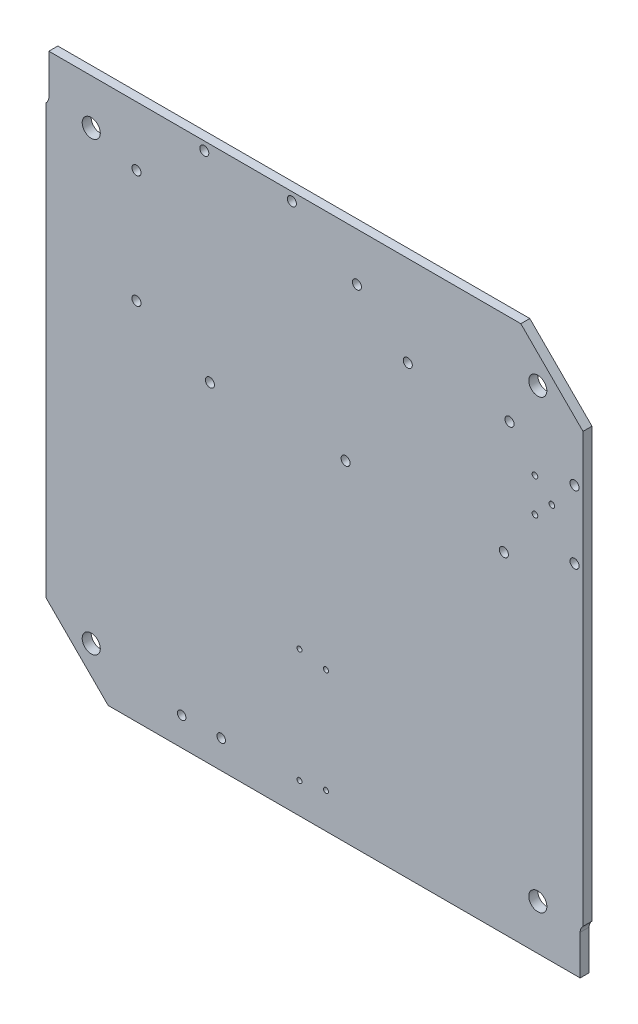
ISO-10303-21;
HEADER;
FILE_DESCRIPTION(('STEP AP214'),'2;1');
FILE_NAME('part.step','',(''),(''),'','','');
FILE_SCHEMA(('AUTOMOTIVE_DESIGN { 1 0 10303 214 1 1 1 1 }'));
ENDSEC;
DATA;
#1=APPLICATION_CONTEXT('core data for automotive mechanical design processes');
#2=APPLICATION_PROTOCOL_DEFINITION('international standard','automotive_design',2000,#1);
#3=PRODUCT_CONTEXT('',#1,'mechanical');
#4=PRODUCT('Part','Part','',(#3));
#5=PRODUCT_RELATED_PRODUCT_CATEGORY('part','',(#4));
#6=PRODUCT_DEFINITION_FORMATION('','',#4);
#7=PRODUCT_DEFINITION_CONTEXT('part definition',#1,'design');
#8=PRODUCT_DEFINITION('design','',#6,#7);
#9=PRODUCT_DEFINITION_SHAPE('','',#8);
#10=(LENGTH_UNIT() NAMED_UNIT(*) SI_UNIT(.MILLI.,.METRE.));
#11=(NAMED_UNIT(*) PLANE_ANGLE_UNIT() SI_UNIT($,.RADIAN.));
#12=(NAMED_UNIT(*) SI_UNIT($,.STERADIAN.) SOLID_ANGLE_UNIT());
#13=UNCERTAINTY_MEASURE_WITH_UNIT(LENGTH_MEASURE(1.E-05),#10,'distance_accuracy_value','');
#14=(GEOMETRIC_REPRESENTATION_CONTEXT(3) GLOBAL_UNCERTAINTY_ASSIGNED_CONTEXT((#13)) GLOBAL_UNIT_ASSIGNED_CONTEXT((#10,
#11,#12)) REPRESENTATION_CONTEXT('',''));
#15=CARTESIAN_POINT('',(0.,0.,0.));
#16=DIRECTION('',(0.,0.,1.));
#17=DIRECTION('',(1.,0.,0.));
#18=AXIS2_PLACEMENT_3D('',#15,#16,#17);
#19=CARTESIAN_POINT('',(0.,0.,1.5875));
#20=DIRECTION('',(0.,0.,1.));
#21=DIRECTION('',(1.,0.,0.));
#22=AXIS2_PLACEMENT_3D('',#19,#20,#21);
#23=PLANE('',#22);
#24=CARTESIAN_POINT('',(-2.667,-21.9289,1.5875));
#25=DIRECTION('',(0.,0.,-1.));
#26=DIRECTION('',(-1.,0.,0.));
#27=AXIS2_PLACEMENT_3D('',#24,#25,#26);
#28=CIRCLE('',#27,0.4445);
#29=CARTESIAN_POINT('',(-2.2225,-21.9289,1.5875));
#30=VERTEX_POINT('',#29);
#31=EDGE_CURVE('E183',#30,#30,#28,.T.);
#32=ORIENTED_EDGE('',*,*,#31,.T.);
#33=EDGE_LOOP('',(#32));
#34=FACE_BOUND('',#33,.T.);
#35=CARTESIAN_POINT('',(-2.667,-42.0711,1.5875));
#36=DIRECTION('',(0.,0.,-1.));
#37=DIRECTION('',(-1.,0.,0.));
#38=AXIS2_PLACEMENT_3D('',#35,#36,#37);
#39=CIRCLE('',#38,0.4445);
#40=CARTESIAN_POINT('',(-2.2225,-42.0711,1.5875));
#41=VERTEX_POINT('',#40);
#42=EDGE_CURVE('E96',#41,#41,#39,.T.);
#43=ORIENTED_EDGE('',*,*,#42,.T.);
#44=EDGE_LOOP('',(#43));
#45=FACE_BOUND('',#44,.T.);
#46=CARTESIAN_POINT('',(2.032,-22.7545,1.5875));
#47=DIRECTION('',(0.,0.,-1.));
#48=DIRECTION('',(-1.,0.,0.));
#49=AXIS2_PLACEMENT_3D('',#46,#47,#48);
#50=CIRCLE('',#49,0.4445);
#51=CARTESIAN_POINT('',(2.4765,-22.7545,1.5875));
#52=VERTEX_POINT('',#51);
#53=EDGE_CURVE('E93',#52,#52,#50,.T.);
#54=ORIENTED_EDGE('',*,*,#53,.T.);
#55=EDGE_LOOP('',(#54));
#56=FACE_BOUND('',#55,.T.);
#57=CARTESIAN_POINT('',(2.032,-41.2455,1.5875));
#58=DIRECTION('',(0.,0.,-1.));
#59=DIRECTION('',(-1.,0.,0.));
#60=AXIS2_PLACEMENT_3D('',#57,#58,#59);
#61=CIRCLE('',#60,0.4445);
#62=CARTESIAN_POINT('',(2.4765,-41.2455,1.5875));
#63=VERTEX_POINT('',#62);
#64=EDGE_CURVE('E84',#63,#63,#61,.T.);
#65=ORIENTED_EDGE('',*,*,#64,.T.);
#66=EDGE_LOOP('',(#65));
#67=FACE_BOUND('',#66,.T.);
#68=CARTESIAN_POINT('',(39.5,39.5,1.5875));
#69=DIRECTION('',(0.,0.,-1.));
#70=DIRECTION('',(1.,0.,0.));
#71=AXIS2_PLACEMENT_3D('',#68,#69,#70);
#72=CIRCLE('',#71,1.6);
#73=CARTESIAN_POINT('',(41.1,39.5,1.5875));
#74=VERTEX_POINT('',#73);
#75=EDGE_CURVE('E81',#74,#74,#72,.T.);
#76=ORIENTED_EDGE('',*,*,#75,.T.);
#77=EDGE_LOOP('',(#76));
#78=FACE_BOUND('',#77,.T.);
#79=CARTESIAN_POINT('',(-39.5,39.5,1.5875));
#80=DIRECTION('',(0.,0.,-1.));
#81=DIRECTION('',(-1.,0.,0.));
#82=AXIS2_PLACEMENT_3D('',#79,#80,#81);
#83=CIRCLE('',#82,1.6);
#84=CARTESIAN_POINT('',(-41.1,39.5,1.5875));
#85=VERTEX_POINT('',#84);
#86=EDGE_CURVE('E78',#85,#85,#83,.T.);
#87=ORIENTED_EDGE('',*,*,#86,.T.);
#88=EDGE_LOOP('',(#87));
#89=FACE_BOUND('',#88,.T.);
#90=CARTESIAN_POINT('',(39.5,-39.5,1.5875));
#91=DIRECTION('',(0.,0.,-1.));
#92=DIRECTION('',(1.,0.,0.));
#93=AXIS2_PLACEMENT_3D('',#90,#91,#92);
#94=CIRCLE('',#93,1.6);
#95=CARTESIAN_POINT('',(41.1,-39.5,1.5875));
#96=VERTEX_POINT('',#95);
#97=EDGE_CURVE('E82',#96,#96,#94,.T.);
#98=ORIENTED_EDGE('',*,*,#97,.T.);
#99=EDGE_LOOP('',(#98));
#100=FACE_BOUND('',#99,.T.);
#101=CARTESIAN_POINT('',(-39.5,-39.5,1.5875));
#102=DIRECTION('',(0.,0.,-1.));
#103=DIRECTION('',(-1.,0.,0.));
#104=AXIS2_PLACEMENT_3D('',#101,#102,#103);
#105=CIRCLE('',#104,1.6);
#106=CARTESIAN_POINT('',(-41.1,-39.5,1.5875));
#107=VERTEX_POINT('',#106);
#108=EDGE_CURVE('E19',#107,#107,#105,.T.);
#109=ORIENTED_EDGE('',*,*,#108,.T.);
#110=EDGE_LOOP('',(#109));
#111=FACE_BOUND('',#110,.T.);
#112=CARTESIAN_POINT('',(-23.5,-42.5,1.5875));
#113=DIRECTION('',(0.,0.,-1.));
#114=DIRECTION('',(-1.,0.,0.));
#115=AXIS2_PLACEMENT_3D('',#112,#113,#114);
#116=CIRCLE('',#115,0.75);
#117=CARTESIAN_POINT('',(-22.75,-42.5,1.5875));
#118=VERTEX_POINT('',#117);
#119=EDGE_CURVE('E126',#118,#118,#116,.T.);
#120=ORIENTED_EDGE('',*,*,#119,.T.);
#121=EDGE_LOOP('',(#120));
#122=FACE_BOUND('',#121,.T.);
#123=CARTESIAN_POINT('',(-16.5,-42.5,1.5875));
#124=DIRECTION('',(0.,0.,-1.));
#125=DIRECTION('',(-1.,0.,0.));
#126=AXIS2_PLACEMENT_3D('',#123,#124,#125);
#127=CIRCLE('',#126,0.75);
#128=CARTESIAN_POINT('',(-15.75,-42.5,1.5875));
#129=VERTEX_POINT('',#128);
#130=EDGE_CURVE('E89',#129,#129,#127,.T.);
#131=ORIENTED_EDGE('',*,*,#130,.T.);
#132=EDGE_LOOP('',(#131));
#133=FACE_BOUND('',#132,.T.);
#134=CARTESIAN_POINT('',(-48.6002,40.5,1.5875));
#135=DIRECTION('',(0.,0.,-1.));
#136=DIRECTION('',(0.687539057617794,-0.726147398432327,0.));
#137=AXIS2_PLACEMENT_3D('',#134,#135,#136);
#138=CIRCLE('',#137,1.6002);
#139=CARTESIAN_POINT('',(-47.,40.5,1.5875));
#140=VERTEX_POINT('',#139);
#141=CARTESIAN_POINT('',(-47.5,39.3380189330286,1.5875));
#142=VERTEX_POINT('',#141);
#143=EDGE_CURVE('E145',#140,#142,#138,.T.);
#144=ORIENTED_EDGE('',*,*,#143,.T.);
#145=DIRECTION('',(0.,1.,0.));
#146=VECTOR('',#145,1.);
#147=CARTESIAN_POINT('',(-47.5,-47.5,1.5875));
#148=LINE('',#147,#146);
#149=CARTESIAN_POINT('',(-47.5,-36.5,1.5875));
#150=VERTEX_POINT('',#149);
#151=EDGE_CURVE('E163',#150,#142,#148,.T.);
#152=ORIENTED_EDGE('',*,*,#151,.F.);
#153=DIRECTION('',(-0.707106781186548,0.707106781186548,0.));
#154=VECTOR('',#153,1.);
#155=CARTESIAN_POINT('',(-42.,-42.,1.5875));
#156=LINE('',#155,#154);
#157=CARTESIAN_POINT('',(-36.5,-47.5,1.5875));
#158=VERTEX_POINT('',#157);
#159=EDGE_CURVE('E103',#158,#150,#156,.T.);
#160=ORIENTED_EDGE('',*,*,#159,.F.);
#161=DIRECTION('',(-1.,0.,0.));
#162=VECTOR('',#161,1.);
#163=CARTESIAN_POINT('',(47.5,-47.5,1.5875));
#164=LINE('',#163,#162);
#165=CARTESIAN_POINT('',(47.,-47.5,1.5875));
#166=VERTEX_POINT('',#165);
#167=EDGE_CURVE('E11',#166,#158,#164,.T.);
#168=ORIENTED_EDGE('',*,*,#167,.F.);
#169=DIRECTION('',(0.,1.,0.));
#170=VECTOR('',#169,1.);
#171=CARTESIAN_POINT('',(47.,-20.25,1.5875));
#172=LINE('',#171,#170);
#173=CARTESIAN_POINT('',(47.,-40.5,1.5875));
#174=VERTEX_POINT('',#173);
#175=EDGE_CURVE('E224',#166,#174,#172,.T.);
#176=ORIENTED_EDGE('',*,*,#175,.T.);
#177=CARTESIAN_POINT('',(48.6002,-40.5,1.5875));
#178=DIRECTION('',(0.,0.,-1.));
#179=DIRECTION('',(-0.687539057617797,0.726147398432324,0.));
#180=AXIS2_PLACEMENT_3D('',#177,#178,#179);
#181=CIRCLE('',#180,1.6002);
#182=CARTESIAN_POINT('',(47.5,-39.3380189330286,1.5875));
#183=VERTEX_POINT('',#182);
#184=EDGE_CURVE('E235',#174,#183,#181,.T.);
#185=ORIENTED_EDGE('',*,*,#184,.T.);
#186=DIRECTION('',(0.,-1.,0.));
#187=VECTOR('',#186,1.);
#188=CARTESIAN_POINT('',(47.5,47.5,1.5875));
#189=LINE('',#188,#187);
#190=CARTESIAN_POINT('',(47.5,36.5,1.5875));
#191=VERTEX_POINT('',#190);
#192=EDGE_CURVE('E112',#191,#183,#189,.T.);
#193=ORIENTED_EDGE('',*,*,#192,.F.);
#194=DIRECTION('',(0.707106781186548,-0.707106781186548,0.));
#195=VECTOR('',#194,1.);
#196=CARTESIAN_POINT('',(42.,42.,1.5875));
#197=LINE('',#196,#195);
#198=CARTESIAN_POINT('',(36.5,47.5,1.5875));
#199=VERTEX_POINT('',#198);
#200=EDGE_CURVE('E186',#199,#191,#197,.T.);
#201=ORIENTED_EDGE('',*,*,#200,.F.);
#202=DIRECTION('',(1.,0.,0.));
#203=VECTOR('',#202,1.);
#204=CARTESIAN_POINT('',(-47.5,47.5,1.5875));
#205=LINE('',#204,#203);
#206=CARTESIAN_POINT('',(-47.,47.5,1.5875));
#207=VERTEX_POINT('',#206);
#208=EDGE_CURVE('E111',#207,#199,#205,.T.);
#209=ORIENTED_EDGE('',*,*,#208,.F.);
#210=DIRECTION('',(0.,-1.,0.));
#211=VECTOR('',#210,1.);
#212=CARTESIAN_POINT('',(-47.,20.25,1.5875));
#213=LINE('',#212,#211);
#214=EDGE_CURVE('E212',#207,#140,#213,.T.);
#215=ORIENTED_EDGE('',*,*,#214,.T.);
#216=EDGE_LOOP('',(#144,#152,#160,#168,#176,#185,#193,#201,#209,#215));
#217=FACE_BOUND('',#216,.T.);
#218=CARTESIAN_POINT('',(42.,22.5,1.5875));
#219=DIRECTION('',(0.,0.,-1.));
#220=DIRECTION('',(-1.,0.,0.));
#221=AXIS2_PLACEMENT_3D('',#218,#219,#220);
#222=CIRCLE('',#221,0.5);
#223=CARTESIAN_POINT('',(42.5,22.5,1.5875));
#224=VERTEX_POINT('',#223);
#225=EDGE_CURVE('E101',#224,#224,#222,.T.);
#226=ORIENTED_EDGE('',*,*,#225,.T.);
#227=EDGE_LOOP('',(#226));
#228=FACE_BOUND('',#227,.T.);
#229=CARTESIAN_POINT('',(39.,25.5,1.5875));
#230=DIRECTION('',(0.,0.,-1.));
#231=DIRECTION('',(-1.,0.,0.));
#232=AXIS2_PLACEMENT_3D('',#229,#230,#231);
#233=CIRCLE('',#232,0.5);
#234=CARTESIAN_POINT('',(39.5,25.5,1.5875));
#235=VERTEX_POINT('',#234);
#236=EDGE_CURVE('E251',#235,#235,#233,.T.);
#237=ORIENTED_EDGE('',*,*,#236,.T.);
#238=EDGE_LOOP('',(#237));
#239=FACE_BOUND('',#238,.T.);
#240=CARTESIAN_POINT('',(39.,19.5,1.5875));
#241=DIRECTION('',(0.,0.,-1.));
#242=DIRECTION('',(-1.,0.,0.));
#243=AXIS2_PLACEMENT_3D('',#240,#241,#242);
#244=CIRCLE('',#243,0.5);
#245=CARTESIAN_POINT('',(39.5,19.5,1.5875));
#246=VERTEX_POINT('',#245);
#247=EDGE_CURVE('E173',#246,#246,#244,.T.);
#248=ORIENTED_EDGE('',*,*,#247,.T.);
#249=EDGE_LOOP('',(#248));
#250=FACE_BOUND('',#249,.T.);
#251=CARTESIAN_POINT('',(33.5,11.,1.5875));
#252=DIRECTION('',(0.,0.,-1.));
#253=DIRECTION('',(-1.,0.,0.));
#254=AXIS2_PLACEMENT_3D('',#251,#252,#253);
#255=CIRCLE('',#254,0.8);
#256=CARTESIAN_POINT('',(34.3,11.,1.5875));
#257=VERTEX_POINT('',#256);
#258=EDGE_CURVE('E210',#257,#257,#255,.T.);
#259=ORIENTED_EDGE('',*,*,#258,.T.);
#260=EDGE_LOOP('',(#259));
#261=FACE_BOUND('',#260,.T.);
#262=CARTESIAN_POINT('',(-18.5,11.,1.5875));
#263=DIRECTION('',(0.,0.,-1.));
#264=DIRECTION('',(-1.,0.,0.));
#265=AXIS2_PLACEMENT_3D('',#262,#263,#264);
#266=CIRCLE('',#265,0.8);
#267=CARTESIAN_POINT('',(-17.7,11.,1.5875));
#268=VERTEX_POINT('',#267);
#269=EDGE_CURVE('E211',#268,#268,#266,.T.);
#270=ORIENTED_EDGE('',*,*,#269,.T.);
#271=EDGE_LOOP('',(#270));
#272=FACE_BOUND('',#271,.T.);
#273=CARTESIAN_POINT('',(5.5,11.,1.5875));
#274=DIRECTION('',(0.,0.,-1.));
#275=DIRECTION('',(-1.,0.,0.));
#276=AXIS2_PLACEMENT_3D('',#273,#274,#275);
#277=CIRCLE('',#276,0.8);
#278=CARTESIAN_POINT('',(6.3,11.,1.5875));
#279=VERTEX_POINT('',#278);
#280=EDGE_CURVE('E178',#279,#279,#277,.T.);
#281=ORIENTED_EDGE('',*,*,#280,.T.);
#282=EDGE_LOOP('',(#281));
#283=FACE_BOUND('',#282,.T.);
#284=CARTESIAN_POINT('',(46.,15.5,1.5875));
#285=DIRECTION('',(0.,0.,-1.));
#286=DIRECTION('',(-1.,0.,0.));
#287=AXIS2_PLACEMENT_3D('',#284,#285,#286);
#288=CIRCLE('',#287,0.8);
#289=CARTESIAN_POINT('',(46.8,15.5,1.5875));
#290=VERTEX_POINT('',#289);
#291=EDGE_CURVE('E124',#290,#290,#288,.T.);
#292=ORIENTED_EDGE('',*,*,#291,.T.);
#293=EDGE_LOOP('',(#292));
#294=FACE_BOUND('',#293,.T.);
#295=CARTESIAN_POINT('',(46.,27.5,1.5875));
#296=DIRECTION('',(0.,0.,-1.));
#297=DIRECTION('',(-1.,0.,0.));
#298=AXIS2_PLACEMENT_3D('',#295,#296,#297);
#299=CIRCLE('',#298,0.8);
#300=CARTESIAN_POINT('',(46.8,27.5,1.5875));
#301=VERTEX_POINT('',#300);
#302=EDGE_CURVE('E125',#301,#301,#299,.T.);
#303=ORIENTED_EDGE('',*,*,#302,.T.);
#304=EDGE_LOOP('',(#303));
#305=FACE_BOUND('',#304,.T.);
#306=CARTESIAN_POINT('',(34.5,31.5,1.5875));
#307=DIRECTION('',(0.,0.,-1.));
#308=DIRECTION('',(-1.,0.,0.));
#309=AXIS2_PLACEMENT_3D('',#306,#307,#308);
#310=CIRCLE('',#309,0.8);
#311=CARTESIAN_POINT('',(35.3,31.5,1.5875));
#312=VERTEX_POINT('',#311);
#313=EDGE_CURVE('E119',#312,#312,#310,.T.);
#314=ORIENTED_EDGE('',*,*,#313,.T.);
#315=EDGE_LOOP('',(#314));
#316=FACE_BOUND('',#315,.T.);
#317=CARTESIAN_POINT('',(16.5,31.5,1.5875));
#318=DIRECTION('',(0.,0.,-1.));
#319=DIRECTION('',(-1.,0.,0.));
#320=AXIS2_PLACEMENT_3D('',#317,#318,#319);
#321=CIRCLE('',#320,0.8);
#322=CARTESIAN_POINT('',(17.3,31.5,1.5875));
#323=VERTEX_POINT('',#322);
#324=EDGE_CURVE('E120',#323,#323,#321,.T.);
#325=ORIENTED_EDGE('',*,*,#324,.T.);
#326=EDGE_LOOP('',(#325));
#327=FACE_BOUND('',#326,.T.);
#328=CARTESIAN_POINT('',(-31.5,17.,1.5875));
#329=DIRECTION('',(0.,0.,-1.));
#330=DIRECTION('',(-1.,0.,0.));
#331=AXIS2_PLACEMENT_3D('',#328,#329,#330);
#332=CIRCLE('',#331,0.8);
#333=CARTESIAN_POINT('',(-30.7,17.,1.5875));
#334=VERTEX_POINT('',#333);
#335=EDGE_CURVE('E168',#334,#334,#332,.T.);
#336=ORIENTED_EDGE('',*,*,#335,.T.);
#337=EDGE_LOOP('',(#336));
#338=FACE_BOUND('',#337,.T.);
#339=CARTESIAN_POINT('',(-31.5,37.,1.5875));
#340=DIRECTION('',(0.,0.,-1.));
#341=DIRECTION('',(-1.,0.,0.));
#342=AXIS2_PLACEMENT_3D('',#339,#340,#341);
#343=CIRCLE('',#342,0.8);
#344=CARTESIAN_POINT('',(-30.7,37.,1.5875));
#345=VERTEX_POINT('',#344);
#346=EDGE_CURVE('E169',#345,#345,#343,.T.);
#347=ORIENTED_EDGE('',*,*,#346,.T.);
#348=EDGE_LOOP('',(#347));
#349=FACE_BOUND('',#348,.T.);
#350=CARTESIAN_POINT('',(-19.5,46.,1.5875));
#351=DIRECTION('',(0.,0.,-1.));
#352=DIRECTION('',(-1.,0.,0.));
#353=AXIS2_PLACEMENT_3D('',#350,#351,#352);
#354=CIRCLE('',#353,0.8);
#355=CARTESIAN_POINT('',(-18.7,46.,1.5875));
#356=VERTEX_POINT('',#355);
#357=EDGE_CURVE('E138',#356,#356,#354,.T.);
#358=ORIENTED_EDGE('',*,*,#357,.T.);
#359=EDGE_LOOP('',(#358));
#360=FACE_BOUND('',#359,.T.);
#361=CARTESIAN_POINT('',(-4.,46.,1.5875));
#362=DIRECTION('',(0.,0.,-1.));
#363=DIRECTION('',(-1.,0.,0.));
#364=AXIS2_PLACEMENT_3D('',#361,#362,#363);
#365=CIRCLE('',#364,0.8);
#366=CARTESIAN_POINT('',(-3.2,46.,1.5875));
#367=VERTEX_POINT('',#366);
#368=EDGE_CURVE('E139',#367,#367,#365,.T.);
#369=ORIENTED_EDGE('',*,*,#368,.T.);
#370=EDGE_LOOP('',(#369));
#371=FACE_BOUND('',#370,.T.);
#372=CARTESIAN_POINT('',(7.5,39.,1.5875));
#373=DIRECTION('',(0.,0.,-1.));
#374=DIRECTION('',(-1.,0.,0.));
#375=AXIS2_PLACEMENT_3D('',#372,#373,#374);
#376=CIRCLE('',#375,0.8);
#377=CARTESIAN_POINT('',(8.3,39.,1.5875));
#378=VERTEX_POINT('',#377);
#379=EDGE_CURVE('E146',#378,#378,#376,.T.);
#380=ORIENTED_EDGE('',*,*,#379,.T.);
#381=EDGE_LOOP('',(#380));
#382=FACE_BOUND('',#381,.T.);
#383=ADVANCED_FACE('F16',(#34,#45,#56,#67,#78,#89,#100,#111,#122,#133,#217,#228,#239,#250,#261,
#272,#283,#294,#305,#316,#327,#338,#349,#360,#371,#382),#23,.T.);
#384=CARTESIAN_POINT('',(47.5,-47.5,0.));
#385=DIRECTION('',(0.,-1.,0.));
#386=DIRECTION('',(0.,0.,-1.));
#387=AXIS2_PLACEMENT_3D('',#384,#385,#386);
#388=PLANE('',#387);
#389=DIRECTION('',(0.,0.,1.));
#390=VECTOR('',#389,1.);
#391=CARTESIAN_POINT('',(47.,-47.5,0.79375));
#392=LINE('',#391,#390);
#393=CARTESIAN_POINT('',(47.,-47.5,0.));
#394=VERTEX_POINT('',#393);
#395=EDGE_CURVE('E161',#394,#166,#392,.T.);
#396=ORIENTED_EDGE('',*,*,#395,.T.);
#397=ORIENTED_EDGE('',*,*,#167,.T.);
#398=DIRECTION('',(0.,0.,1.));
#399=VECTOR('',#398,1.);
#400=CARTESIAN_POINT('',(-36.5,-47.5,0.));
#401=LINE('',#400,#399);
#402=CARTESIAN_POINT('',(-36.5,-47.5,0.));
#403=VERTEX_POINT('',#402);
#404=EDGE_CURVE('E26',#403,#158,#401,.T.);
#405=ORIENTED_EDGE('',*,*,#404,.F.);
#406=DIRECTION('',(-1.,0.,0.));
#407=VECTOR('',#406,1.);
#408=CARTESIAN_POINT('',(47.5,-47.5,0.));
#409=LINE('',#408,#407);
#410=EDGE_CURVE('E155',#394,#403,#409,.T.);
#411=ORIENTED_EDGE('',*,*,#410,.F.);
#412=EDGE_LOOP('',(#396,#397,#405,#411));
#413=FACE_BOUND('',#412,.T.);
#414=ADVANCED_FACE('F313',(#413),#388,.T.);
#415=CARTESIAN_POINT('',(-42.,-42.,0.));
#416=DIRECTION('',(-0.707106781186548,-0.707106781186548,0.));
#417=DIRECTION('',(0.,0.,1.));
#418=AXIS2_PLACEMENT_3D('',#415,#416,#417);
#419=PLANE('',#418);
#420=ORIENTED_EDGE('',*,*,#159,.T.);
#421=DIRECTION('',(0.,0.,-1.));
#422=VECTOR('',#421,1.);
#423=CARTESIAN_POINT('',(-47.5,-36.5,0.));
#424=LINE('',#423,#422);
#425=CARTESIAN_POINT('',(-47.5,-36.5,0.));
#426=VERTEX_POINT('',#425);
#427=EDGE_CURVE('E160',#150,#426,#424,.T.);
#428=ORIENTED_EDGE('',*,*,#427,.T.);
#429=DIRECTION('',(0.707106781186548,-0.707106781186548,0.));
#430=VECTOR('',#429,1.);
#431=CARTESIAN_POINT('',(-42.,-42.,0.));
#432=LINE('',#431,#430);
#433=EDGE_CURVE('E264',#426,#403,#432,.T.);
#434=ORIENTED_EDGE('',*,*,#433,.T.);
#435=ORIENTED_EDGE('',*,*,#404,.T.);
#436=EDGE_LOOP('',(#420,#428,#434,#435));
#437=FACE_BOUND('',#436,.T.);
#438=ADVANCED_FACE('F318',(#437),#419,.T.);
#439=CARTESIAN_POINT('',(-47.5,47.5,0.));
#440=DIRECTION('',(0.,1.,0.));
#441=DIRECTION('',(0.,0.,1.));
#442=AXIS2_PLACEMENT_3D('',#439,#440,#441);
#443=PLANE('',#442);
#444=DIRECTION('',(0.,0.,1.));
#445=VECTOR('',#444,1.);
#446=CARTESIAN_POINT('',(-47.,47.5,0.79375));
#447=LINE('',#446,#445);
#448=CARTESIAN_POINT('',(-47.,47.5,0.));
#449=VERTEX_POINT('',#448);
#450=EDGE_CURVE('E215',#449,#207,#447,.T.);
#451=ORIENTED_EDGE('',*,*,#450,.T.);
#452=ORIENTED_EDGE('',*,*,#208,.T.);
#453=DIRECTION('',(0.,0.,1.));
#454=VECTOR('',#453,1.);
#455=CARTESIAN_POINT('',(36.5,47.5,0.));
#456=LINE('',#455,#454);
#457=CARTESIAN_POINT('',(36.5,47.5,0.));
#458=VERTEX_POINT('',#457);
#459=EDGE_CURVE('E204',#458,#199,#456,.T.);
#460=ORIENTED_EDGE('',*,*,#459,.F.);
#461=DIRECTION('',(1.,0.,0.));
#462=VECTOR('',#461,1.);
#463=CARTESIAN_POINT('',(-47.5,47.5,0.));
#464=LINE('',#463,#462);
#465=EDGE_CURVE('E129',#449,#458,#464,.T.);
#466=ORIENTED_EDGE('',*,*,#465,.F.);
#467=EDGE_LOOP('',(#451,#452,#460,#466));
#468=FACE_BOUND('',#467,.T.);
#469=ADVANCED_FACE('F306',(#468),#443,.T.);
#470=CARTESIAN_POINT('',(42.,42.,0.));
#471=DIRECTION('',(0.707106781186548,0.707106781186548,0.));
#472=DIRECTION('',(0.,0.,-1.));
#473=AXIS2_PLACEMENT_3D('',#470,#471,#472);
#474=PLANE('',#473);
#475=ORIENTED_EDGE('',*,*,#200,.T.);
#476=DIRECTION('',(0.,0.,-1.));
#477=VECTOR('',#476,1.);
#478=CARTESIAN_POINT('',(47.5,36.5,0.));
#479=LINE('',#478,#477);
#480=CARTESIAN_POINT('',(47.5,36.5,0.));
#481=VERTEX_POINT('',#480);
#482=EDGE_CURVE('E116',#191,#481,#479,.T.);
#483=ORIENTED_EDGE('',*,*,#482,.T.);
#484=DIRECTION('',(-0.707106781186548,0.707106781186548,0.));
#485=VECTOR('',#484,1.);
#486=CARTESIAN_POINT('',(42.,42.,0.));
#487=LINE('',#486,#485);
#488=EDGE_CURVE('E133',#481,#458,#487,.T.);
#489=ORIENTED_EDGE('',*,*,#488,.T.);
#490=ORIENTED_EDGE('',*,*,#459,.T.);
#491=EDGE_LOOP('',(#475,#483,#489,#490));
#492=FACE_BOUND('',#491,.T.);
#493=ADVANCED_FACE('F295',(#492),#474,.T.);
#494=CARTESIAN_POINT('',(-2.667,-21.9289,1.5875));
#495=DIRECTION('',(0.,0.,1.));
#496=DIRECTION('',(-1.,0.,0.));
#497=AXIS2_PLACEMENT_3D('',#494,#495,#496);
#498=CYLINDRICAL_SURFACE('',#497,0.4445);
#499=ORIENTED_EDGE('',*,*,#31,.F.);
#500=EDGE_LOOP('',(#499));
#501=FACE_BOUND('',#500,.T.);
#502=CARTESIAN_POINT('',(-2.667,-21.9289,0.));
#503=DIRECTION('',(0.,0.,1.));
#504=DIRECTION('',(-1.,0.,0.));
#505=AXIS2_PLACEMENT_3D('',#502,#503,#504);
#506=CIRCLE('',#505,0.4445);
#507=CARTESIAN_POINT('',(-2.2225,-21.9289,0.));
#508=VERTEX_POINT('',#507);
#509=EDGE_CURVE('E196',#508,#508,#506,.T.);
#510=ORIENTED_EDGE('',*,*,#509,.F.);
#511=EDGE_LOOP('',(#510));
#512=FACE_BOUND('',#511,.T.);
#513=ADVANCED_FACE('F292',(#501,#512),#498,.F.);
#514=CARTESIAN_POINT('',(-2.667,-42.0711,1.5875));
#515=DIRECTION('',(0.,0.,1.));
#516=DIRECTION('',(-1.,0.,0.));
#517=AXIS2_PLACEMENT_3D('',#514,#515,#516);
#518=CYLINDRICAL_SURFACE('',#517,0.4445);
#519=ORIENTED_EDGE('',*,*,#42,.F.);
#520=EDGE_LOOP('',(#519));
#521=FACE_BOUND('',#520,.T.);
#522=CARTESIAN_POINT('',(-2.667,-42.0711,0.));
#523=DIRECTION('',(0.,0.,1.));
#524=DIRECTION('',(-1.,0.,0.));
#525=AXIS2_PLACEMENT_3D('',#522,#523,#524);
#526=CIRCLE('',#525,0.4445);
#527=CARTESIAN_POINT('',(-2.2225,-42.0711,0.));
#528=VERTEX_POINT('',#527);
#529=EDGE_CURVE('E108',#528,#528,#526,.T.);
#530=ORIENTED_EDGE('',*,*,#529,.F.);
#531=EDGE_LOOP('',(#530));
#532=FACE_BOUND('',#531,.T.);
#533=ADVANCED_FACE('F294',(#521,#532),#518,.F.);
#534=CARTESIAN_POINT('',(2.032,-22.7545,1.5875));
#535=DIRECTION('',(0.,0.,1.));
#536=DIRECTION('',(-1.,0.,0.));
#537=AXIS2_PLACEMENT_3D('',#534,#535,#536);
#538=CYLINDRICAL_SURFACE('',#537,0.4445);
#539=ORIENTED_EDGE('',*,*,#53,.F.);
#540=EDGE_LOOP('',(#539));
#541=FACE_BOUND('',#540,.T.);
#542=CARTESIAN_POINT('',(2.032,-22.7545,0.));
#543=DIRECTION('',(0.,0.,1.));
#544=DIRECTION('',(-1.,0.,0.));
#545=AXIS2_PLACEMENT_3D('',#542,#543,#544);
#546=CIRCLE('',#545,0.4445);
#547=CARTESIAN_POINT('',(2.4765,-22.7545,0.));
#548=VERTEX_POINT('',#547);
#549=EDGE_CURVE('E104',#548,#548,#546,.T.);
#550=ORIENTED_EDGE('',*,*,#549,.F.);
#551=EDGE_LOOP('',(#550));
#552=FACE_BOUND('',#551,.T.);
#553=ADVANCED_FACE('F303',(#541,#552),#538,.F.);
#554=CARTESIAN_POINT('',(2.032,-41.2455,1.5875));
#555=DIRECTION('',(0.,0.,1.));
#556=DIRECTION('',(-1.,0.,0.));
#557=AXIS2_PLACEMENT_3D('',#554,#555,#556);
#558=CYLINDRICAL_SURFACE('',#557,0.4445);
#559=ORIENTED_EDGE('',*,*,#64,.F.);
#560=EDGE_LOOP('',(#559));
#561=FACE_BOUND('',#560,.T.);
#562=CARTESIAN_POINT('',(2.032,-41.2455,0.));
#563=DIRECTION('',(0.,0.,1.));
#564=DIRECTION('',(-1.,0.,0.));
#565=AXIS2_PLACEMENT_3D('',#562,#563,#564);
#566=CIRCLE('',#565,0.4445);
#567=CARTESIAN_POINT('',(2.4765,-41.2455,0.));
#568=VERTEX_POINT('',#567);
#569=EDGE_CURVE('E107',#568,#568,#566,.T.);
#570=ORIENTED_EDGE('',*,*,#569,.F.);
#571=EDGE_LOOP('',(#570));
#572=FACE_BOUND('',#571,.T.);
#573=ADVANCED_FACE('F335',(#561,#572),#558,.F.);
#574=CARTESIAN_POINT('',(39.5,39.5,-132.772167148479));
#575=DIRECTION('',(0.,0.,-1.));
#576=DIRECTION('',(1.,0.,0.));
#577=AXIS2_PLACEMENT_3D('',#574,#575,#576);
#578=CYLINDRICAL_SURFACE('',#577,1.6);
#579=ORIENTED_EDGE('',*,*,#75,.F.);
#580=EDGE_LOOP('',(#579));
#581=FACE_BOUND('',#580,.T.);
#582=CARTESIAN_POINT('',(39.5,39.5,0.));
#583=DIRECTION('',(0.,0.,1.));
#584=DIRECTION('',(1.,0.,0.));
#585=AXIS2_PLACEMENT_3D('',#582,#583,#584);
#586=CIRCLE('',#585,1.6);
#587=CARTESIAN_POINT('',(37.9,39.5,0.));
#588=VERTEX_POINT('',#587);
#589=EDGE_CURVE('E199',#588,#588,#586,.T.);
#590=ORIENTED_EDGE('',*,*,#589,.F.);
#591=EDGE_LOOP('',(#590));
#592=FACE_BOUND('',#591,.T.);
#593=ADVANCED_FACE('F331',(#581,#592),#578,.F.);
#594=CARTESIAN_POINT('',(-39.5,39.5,-132.772167148479));
#595=DIRECTION('',(0.,0.,1.));
#596=DIRECTION('',(-1.,0.,0.));
#597=AXIS2_PLACEMENT_3D('',#594,#595,#596);
#598=CYLINDRICAL_SURFACE('',#597,1.6);
#599=ORIENTED_EDGE('',*,*,#86,.F.);
#600=EDGE_LOOP('',(#599));
#601=FACE_BOUND('',#600,.T.);
#602=CARTESIAN_POINT('',(-39.5,39.5,0.));
#603=DIRECTION('',(0.,0.,1.));
#604=DIRECTION('',(-1.,0.,0.));
#605=AXIS2_PLACEMENT_3D('',#602,#603,#604);
#606=CIRCLE('',#605,1.6);
#607=CARTESIAN_POINT('',(-37.9,39.5,0.));
#608=VERTEX_POINT('',#607);
#609=EDGE_CURVE('E230',#608,#608,#606,.T.);
#610=ORIENTED_EDGE('',*,*,#609,.F.);
#611=EDGE_LOOP('',(#610));
#612=FACE_BOUND('',#611,.T.);
#613=ADVANCED_FACE('F334',(#601,#612),#598,.F.);
#614=CARTESIAN_POINT('',(39.5,-39.5,-132.772167148479));
#615=DIRECTION('',(0.,0.,1.));
#616=DIRECTION('',(1.,0.,0.));
#617=AXIS2_PLACEMENT_3D('',#614,#615,#616);
#618=CYLINDRICAL_SURFACE('',#617,1.6);
#619=ORIENTED_EDGE('',*,*,#97,.F.);
#620=EDGE_LOOP('',(#619));
#621=FACE_BOUND('',#620,.T.);
#622=CARTESIAN_POINT('',(39.5,-39.5,0.));
#623=DIRECTION('',(0.,0.,1.));
#624=DIRECTION('',(1.,0.,0.));
#625=AXIS2_PLACEMENT_3D('',#622,#623,#624);
#626=CIRCLE('',#625,1.6);
#627=CARTESIAN_POINT('',(37.9,-39.5,0.));
#628=VERTEX_POINT('',#627);
#629=EDGE_CURVE('E239',#628,#628,#626,.T.);
#630=ORIENTED_EDGE('',*,*,#629,.F.);
#631=EDGE_LOOP('',(#630));
#632=FACE_BOUND('',#631,.T.);
#633=ADVANCED_FACE('F562',(#621,#632),#618,.F.);
#634=CARTESIAN_POINT('',(-39.5,-39.5,-132.772167148479));
#635=DIRECTION('',(0.,0.,-1.));
#636=DIRECTION('',(-1.,0.,0.));
#637=AXIS2_PLACEMENT_3D('',#634,#635,#636);
#638=CYLINDRICAL_SURFACE('',#637,1.6);
#639=ORIENTED_EDGE('',*,*,#108,.F.);
#640=EDGE_LOOP('',(#639));
#641=FACE_BOUND('',#640,.T.);
#642=CARTESIAN_POINT('',(-39.5,-39.5,0.));
#643=DIRECTION('',(0.,0.,1.));
#644=DIRECTION('',(-1.,0.,0.));
#645=AXIS2_PLACEMENT_3D('',#642,#643,#644);
#646=CIRCLE('',#645,1.6);
#647=CARTESIAN_POINT('',(-37.9,-39.5,0.));
#648=VERTEX_POINT('',#647);
#649=EDGE_CURVE('E242',#648,#648,#646,.T.);
#650=ORIENTED_EDGE('',*,*,#649,.F.);
#651=EDGE_LOOP('',(#650));
#652=FACE_BOUND('',#651,.T.);
#653=ADVANCED_FACE('F599',(#641,#652),#638,.F.);
#654=CARTESIAN_POINT('',(-23.5,-42.5,1.5875));
#655=DIRECTION('',(0.,0.,1.));
#656=DIRECTION('',(-1.,0.,0.));
#657=AXIS2_PLACEMENT_3D('',#654,#655,#656);
#658=CYLINDRICAL_SURFACE('',#657,0.75);
#659=ORIENTED_EDGE('',*,*,#119,.F.);
#660=EDGE_LOOP('',(#659));
#661=FACE_BOUND('',#660,.T.);
#662=CARTESIAN_POINT('',(-23.5,-42.5,0.));
#663=DIRECTION('',(0.,0.,1.));
#664=DIRECTION('',(-1.,0.,0.));
#665=AXIS2_PLACEMENT_3D('',#662,#663,#664);
#666=CIRCLE('',#665,0.75);
#667=CARTESIAN_POINT('',(-22.75,-42.5,0.));
#668=VERTEX_POINT('',#667);
#669=EDGE_CURVE('E233',#668,#668,#666,.T.);
#670=ORIENTED_EDGE('',*,*,#669,.F.);
#671=EDGE_LOOP('',(#670));
#672=FACE_BOUND('',#671,.T.);
#673=ADVANCED_FACE('F462',(#661,#672),#658,.F.);
#674=CARTESIAN_POINT('',(-16.5,-42.5,1.5875));
#675=DIRECTION('',(0.,0.,1.));
#676=DIRECTION('',(-1.,0.,0.));
#677=AXIS2_PLACEMENT_3D('',#674,#675,#676);
#678=CYLINDRICAL_SURFACE('',#677,0.75);
#679=ORIENTED_EDGE('',*,*,#130,.F.);
#680=EDGE_LOOP('',(#679));
#681=FACE_BOUND('',#680,.T.);
#682=CARTESIAN_POINT('',(-16.5,-42.5,0.));
#683=DIRECTION('',(0.,0.,1.));
#684=DIRECTION('',(-1.,0.,0.));
#685=AXIS2_PLACEMENT_3D('',#682,#683,#684);
#686=CIRCLE('',#685,0.75);
#687=CARTESIAN_POINT('',(-15.75,-42.5,0.));
#688=VERTEX_POINT('',#687);
#689=EDGE_CURVE('E134',#688,#688,#686,.T.);
#690=ORIENTED_EDGE('',*,*,#689,.F.);
#691=EDGE_LOOP('',(#690));
#692=FACE_BOUND('',#691,.T.);
#693=ADVANCED_FACE('F459',(#681,#692),#678,.F.);
#694=CARTESIAN_POINT('',(47.5,47.5,0.));
#695=DIRECTION('',(1.,0.,0.));
#696=DIRECTION('',(0.,0.,-1.));
#697=AXIS2_PLACEMENT_3D('',#694,#695,#696);
#698=PLANE('',#697);
#699=DIRECTION('',(0.,0.,-1.));
#700=VECTOR('',#699,1.);
#701=CARTESIAN_POINT('',(47.5,-39.3380189330286,1.5875));
#702=LINE('',#701,#700);
#703=CARTESIAN_POINT('',(47.5,-39.3380189330286,0.));
#704=VERTEX_POINT('',#703);
#705=EDGE_CURVE('E221',#183,#704,#702,.T.);
#706=ORIENTED_EDGE('',*,*,#705,.T.);
#707=DIRECTION('',(0.,-1.,0.));
#708=VECTOR('',#707,1.);
#709=CARTESIAN_POINT('',(47.5,47.5,0.));
#710=LINE('',#709,#708);
#711=EDGE_CURVE('E151',#481,#704,#710,.T.);
#712=ORIENTED_EDGE('',*,*,#711,.F.);
#713=ORIENTED_EDGE('',*,*,#482,.F.);
#714=ORIENTED_EDGE('',*,*,#192,.T.);
#715=EDGE_LOOP('',(#706,#712,#713,#714));
#716=FACE_BOUND('',#715,.T.);
#717=ADVANCED_FACE('F344',(#716),#698,.T.);
#718=CARTESIAN_POINT('',(0.,0.,0.));
#719=DIRECTION('',(0.,0.,1.));
#720=DIRECTION('',(1.,0.,0.));
#721=AXIS2_PLACEMENT_3D('',#718,#719,#720);
#722=PLANE('',#721);
#723=CARTESIAN_POINT('',(-48.6002,40.5,0.));
#724=DIRECTION('',(0.,0.,1.));
#725=DIRECTION('',(0.687539057617794,-0.726147398432327,0.));
#726=AXIS2_PLACEMENT_3D('',#723,#724,#725);
#727=CIRCLE('',#726,1.6002);
#728=CARTESIAN_POINT('',(-47.5,39.3380189330286,0.));
#729=VERTEX_POINT('',#728);
#730=CARTESIAN_POINT('',(-47.,40.5,0.));
#731=VERTEX_POINT('',#730);
#732=EDGE_CURVE('E97',#729,#731,#727,.T.);
#733=ORIENTED_EDGE('',*,*,#732,.T.);
#734=DIRECTION('',(0.,1.,0.));
#735=VECTOR('',#734,1.);
#736=CARTESIAN_POINT('',(-47.,20.25,0.));
#737=LINE('',#736,#735);
#738=EDGE_CURVE('E144',#731,#449,#737,.T.);
#739=ORIENTED_EDGE('',*,*,#738,.T.);
#740=ORIENTED_EDGE('',*,*,#465,.T.);
#741=ORIENTED_EDGE('',*,*,#488,.F.);
#742=ORIENTED_EDGE('',*,*,#711,.T.);
#743=CARTESIAN_POINT('',(48.6002,-40.5,0.));
#744=DIRECTION('',(0.,0.,1.));
#745=DIRECTION('',(-0.687539057617797,0.726147398432324,0.));
#746=AXIS2_PLACEMENT_3D('',#743,#744,#745);
#747=CIRCLE('',#746,1.6002);
#748=CARTESIAN_POINT('',(47.,-40.5,0.));
#749=VERTEX_POINT('',#748);
#750=EDGE_CURVE('E218',#704,#749,#747,.T.);
#751=ORIENTED_EDGE('',*,*,#750,.T.);
#752=DIRECTION('',(0.,-1.,0.));
#753=VECTOR('',#752,1.);
#754=CARTESIAN_POINT('',(47.,-20.25,0.));
#755=LINE('',#754,#753);
#756=EDGE_CURVE('E227',#749,#394,#755,.T.);
#757=ORIENTED_EDGE('',*,*,#756,.T.);
#758=ORIENTED_EDGE('',*,*,#410,.T.);
#759=ORIENTED_EDGE('',*,*,#433,.F.);
#760=DIRECTION('',(0.,1.,0.));
#761=VECTOR('',#760,1.);
#762=CARTESIAN_POINT('',(-47.5,-47.5,0.));
#763=LINE('',#762,#761);
#764=EDGE_CURVE('E156',#426,#729,#763,.T.);
#765=ORIENTED_EDGE('',*,*,#764,.T.);
#766=EDGE_LOOP('',(#733,#739,#740,#741,#742,#751,#757,#758,#759,#765));
#767=FACE_BOUND('',#766,.T.);
#768=ORIENTED_EDGE('',*,*,#689,.T.);
#769=EDGE_LOOP('',(#768));
#770=FACE_BOUND('',#769,.T.);
#771=ORIENTED_EDGE('',*,*,#669,.T.);
#772=EDGE_LOOP('',(#771));
#773=FACE_BOUND('',#772,.T.);
#774=ORIENTED_EDGE('',*,*,#649,.T.);
#775=EDGE_LOOP('',(#774));
#776=FACE_BOUND('',#775,.T.);
#777=ORIENTED_EDGE('',*,*,#629,.T.);
#778=EDGE_LOOP('',(#777));
#779=FACE_BOUND('',#778,.T.);
#780=ORIENTED_EDGE('',*,*,#609,.T.);
#781=EDGE_LOOP('',(#780));
#782=FACE_BOUND('',#781,.T.);
#783=ORIENTED_EDGE('',*,*,#589,.T.);
#784=EDGE_LOOP('',(#783));
#785=FACE_BOUND('',#784,.T.);
#786=ORIENTED_EDGE('',*,*,#569,.T.);
#787=EDGE_LOOP('',(#786));
#788=FACE_BOUND('',#787,.T.);
#789=ORIENTED_EDGE('',*,*,#549,.T.);
#790=EDGE_LOOP('',(#789));
#791=FACE_BOUND('',#790,.T.);
#792=ORIENTED_EDGE('',*,*,#529,.T.);
#793=EDGE_LOOP('',(#792));
#794=FACE_BOUND('',#793,.T.);
#795=ORIENTED_EDGE('',*,*,#509,.T.);
#796=EDGE_LOOP('',(#795));
#797=FACE_BOUND('',#796,.T.);
#798=CARTESIAN_POINT('',(42.,22.5,0.));
#799=DIRECTION('',(0.,0.,1.));
#800=DIRECTION('',(-1.,0.,0.));
#801=AXIS2_PLACEMENT_3D('',#798,#799,#800);
#802=CIRCLE('',#801,0.5);
#803=CARTESIAN_POINT('',(42.5,22.5,0.));
#804=VERTEX_POINT('',#803);
#805=EDGE_CURVE('E254',#804,#804,#802,.T.);
#806=ORIENTED_EDGE('',*,*,#805,.T.);
#807=EDGE_LOOP('',(#806));
#808=FACE_BOUND('',#807,.T.);
#809=CARTESIAN_POINT('',(39.,25.5,0.));
#810=DIRECTION('',(0.,0.,1.));
#811=DIRECTION('',(-1.,0.,0.));
#812=AXIS2_PLACEMENT_3D('',#809,#810,#811);
#813=CIRCLE('',#812,0.5);
#814=CARTESIAN_POINT('',(39.5,25.5,0.));
#815=VERTEX_POINT('',#814);
#816=EDGE_CURVE('E175',#815,#815,#813,.T.);
#817=ORIENTED_EDGE('',*,*,#816,.T.);
#818=EDGE_LOOP('',(#817));
#819=FACE_BOUND('',#818,.T.);
#820=CARTESIAN_POINT('',(39.,19.5,0.));
#821=DIRECTION('',(0.,0.,1.));
#822=DIRECTION('',(-1.,0.,0.));
#823=AXIS2_PLACEMENT_3D('',#820,#821,#822);
#824=CIRCLE('',#823,0.5);
#825=CARTESIAN_POINT('',(39.5,19.5,0.));
#826=VERTEX_POINT('',#825);
#827=EDGE_CURVE('E176',#826,#826,#824,.T.);
#828=ORIENTED_EDGE('',*,*,#827,.T.);
#829=EDGE_LOOP('',(#828));
#830=FACE_BOUND('',#829,.T.);
#831=CARTESIAN_POINT('',(33.5,11.,0.));
#832=DIRECTION('',(0.,0.,1.));
#833=DIRECTION('',(-1.,0.,0.));
#834=AXIS2_PLACEMENT_3D('',#831,#832,#833);
#835=CIRCLE('',#834,0.8);
#836=CARTESIAN_POINT('',(34.3,11.,0.));
#837=VERTEX_POINT('',#836);
#838=EDGE_CURVE('E207',#837,#837,#835,.T.);
#839=ORIENTED_EDGE('',*,*,#838,.T.);
#840=EDGE_LOOP('',(#839));
#841=FACE_BOUND('',#840,.T.);
#842=CARTESIAN_POINT('',(-18.5,11.,0.));
#843=DIRECTION('',(0.,0.,1.));
#844=DIRECTION('',(-1.,0.,0.));
#845=AXIS2_PLACEMENT_3D('',#842,#843,#844);
#846=CIRCLE('',#845,0.8);
#847=CARTESIAN_POINT('',(-17.7,11.,0.));
#848=VERTEX_POINT('',#847);
#849=EDGE_CURVE('E181',#848,#848,#846,.T.);
#850=ORIENTED_EDGE('',*,*,#849,.T.);
#851=EDGE_LOOP('',(#850));
#852=FACE_BOUND('',#851,.T.);
#853=CARTESIAN_POINT('',(5.5,11.,0.));
#854=DIRECTION('',(0.,0.,1.));
#855=DIRECTION('',(-1.,0.,0.));
#856=AXIS2_PLACEMENT_3D('',#853,#854,#855);
#857=CIRCLE('',#856,0.8);
#858=CARTESIAN_POINT('',(6.3,11.,0.));
#859=VERTEX_POINT('',#858);
#860=EDGE_CURVE('E182',#859,#859,#857,.T.);
#861=ORIENTED_EDGE('',*,*,#860,.T.);
#862=EDGE_LOOP('',(#861));
#863=FACE_BOUND('',#862,.T.);
#864=CARTESIAN_POINT('',(46.,15.5,0.));
#865=DIRECTION('',(0.,0.,1.));
#866=DIRECTION('',(-1.,0.,0.));
#867=AXIS2_PLACEMENT_3D('',#864,#865,#866);
#868=CIRCLE('',#867,0.8);
#869=CARTESIAN_POINT('',(46.8,15.5,0.));
#870=VERTEX_POINT('',#869);
#871=EDGE_CURVE('E121',#870,#870,#868,.T.);
#872=ORIENTED_EDGE('',*,*,#871,.T.);
#873=EDGE_LOOP('',(#872));
#874=FACE_BOUND('',#873,.T.);
#875=CARTESIAN_POINT('',(46.,27.5,0.));
#876=DIRECTION('',(0.,0.,1.));
#877=DIRECTION('',(-1.,0.,0.));
#878=AXIS2_PLACEMENT_3D('',#875,#876,#877);
#879=CIRCLE('',#878,0.8);
#880=CARTESIAN_POINT('',(46.8,27.5,0.));
#881=VERTEX_POINT('',#880);
#882=EDGE_CURVE('E172',#881,#881,#879,.T.);
#883=ORIENTED_EDGE('',*,*,#882,.T.);
#884=EDGE_LOOP('',(#883));
#885=FACE_BOUND('',#884,.T.);
#886=CARTESIAN_POINT('',(34.5,31.5,0.));
#887=DIRECTION('',(0.,0.,1.));
#888=DIRECTION('',(-1.,0.,0.));
#889=AXIS2_PLACEMENT_3D('',#886,#887,#888);
#890=CIRCLE('',#889,0.8);
#891=CARTESIAN_POINT('',(35.3,31.5,0.));
#892=VERTEX_POINT('',#891);
#893=EDGE_CURVE('E117',#892,#892,#890,.T.);
#894=ORIENTED_EDGE('',*,*,#893,.T.);
#895=EDGE_LOOP('',(#894));
#896=FACE_BOUND('',#895,.T.);
#897=CARTESIAN_POINT('',(16.5,31.5,0.));
#898=DIRECTION('',(0.,0.,1.));
#899=DIRECTION('',(-1.,0.,0.));
#900=AXIS2_PLACEMENT_3D('',#897,#898,#899);
#901=CIRCLE('',#900,0.8);
#902=CARTESIAN_POINT('',(17.3,31.5,0.));
#903=VERTEX_POINT('',#902);
#904=EDGE_CURVE('E201',#903,#903,#901,.T.);
#905=ORIENTED_EDGE('',*,*,#904,.T.);
#906=EDGE_LOOP('',(#905));
#907=FACE_BOUND('',#906,.T.);
#908=CARTESIAN_POINT('',(-31.5,17.,0.));
#909=DIRECTION('',(0.,0.,1.));
#910=DIRECTION('',(-1.,0.,0.));
#911=AXIS2_PLACEMENT_3D('',#908,#909,#910);
#912=CIRCLE('',#911,0.8);
#913=CARTESIAN_POINT('',(-30.7,17.,0.));
#914=VERTEX_POINT('',#913);
#915=EDGE_CURVE('E166',#914,#914,#912,.T.);
#916=ORIENTED_EDGE('',*,*,#915,.T.);
#917=EDGE_LOOP('',(#916));
#918=FACE_BOUND('',#917,.T.);
#919=CARTESIAN_POINT('',(-31.5,37.,0.));
#920=DIRECTION('',(0.,0.,1.));
#921=DIRECTION('',(-1.,0.,0.));
#922=AXIS2_PLACEMENT_3D('',#919,#920,#921);
#923=CIRCLE('',#922,0.8);
#924=CARTESIAN_POINT('',(-30.7,37.,0.));
#925=VERTEX_POINT('',#924);
#926=EDGE_CURVE('E187',#925,#925,#923,.T.);
#927=ORIENTED_EDGE('',*,*,#926,.T.);
#928=EDGE_LOOP('',(#927));
#929=FACE_BOUND('',#928,.T.);
#930=CARTESIAN_POINT('',(-19.5,46.,0.));
#931=DIRECTION('',(0.,0.,1.));
#932=DIRECTION('',(-1.,0.,0.));
#933=AXIS2_PLACEMENT_3D('',#930,#931,#932);
#934=CIRCLE('',#933,0.8);
#935=CARTESIAN_POINT('',(-18.7,46.,0.));
#936=VERTEX_POINT('',#935);
#937=EDGE_CURVE('E135',#936,#936,#934,.T.);
#938=ORIENTED_EDGE('',*,*,#937,.T.);
#939=EDGE_LOOP('',(#938));
#940=FACE_BOUND('',#939,.T.);
#941=CARTESIAN_POINT('',(-4.,46.,0.));
#942=DIRECTION('',(0.,0.,1.));
#943=DIRECTION('',(-1.,0.,0.));
#944=AXIS2_PLACEMENT_3D('',#941,#942,#943);
#945=CIRCLE('',#944,0.8);
#946=CARTESIAN_POINT('',(-3.2,46.,0.));
#947=VERTEX_POINT('',#946);
#948=EDGE_CURVE('E149',#947,#947,#945,.T.);
#949=ORIENTED_EDGE('',*,*,#948,.T.);
#950=EDGE_LOOP('',(#949));
#951=FACE_BOUND('',#950,.T.);
#952=CARTESIAN_POINT('',(7.5,39.,0.));
#953=DIRECTION('',(0.,0.,1.));
#954=DIRECTION('',(-1.,0.,0.));
#955=AXIS2_PLACEMENT_3D('',#952,#953,#954);
#956=CIRCLE('',#955,0.8);
#957=CARTESIAN_POINT('',(8.3,39.,0.));
#958=VERTEX_POINT('',#957);
#959=EDGE_CURVE('E150',#958,#958,#956,.T.);
#960=ORIENTED_EDGE('',*,*,#959,.T.);
#961=EDGE_LOOP('',(#960));
#962=FACE_BOUND('',#961,.T.);
#963=ADVANCED_FACE('F286',(#767,#770,#773,#776,#779,#782,#785,#788,#791,#794,#797,#808,#819,
#830,#841,#852,#863,#874,#885,#896,#907,#918,#929,#940,#951,#962),#722,.F.);
#964=CARTESIAN_POINT('',(-47.5,-47.5,0.));
#965=DIRECTION('',(-1.,0.,0.));
#966=DIRECTION('',(0.,0.,1.));
#967=AXIS2_PLACEMENT_3D('',#964,#965,#966);
#968=PLANE('',#967);
#969=DIRECTION('',(0.,0.,-1.));
#970=VECTOR('',#969,1.);
#971=CARTESIAN_POINT('',(-47.5,39.3380189330286,1.5875));
#972=LINE('',#971,#970);
#973=EDGE_CURVE('E100',#142,#729,#972,.T.);
#974=ORIENTED_EDGE('',*,*,#973,.T.);
#975=ORIENTED_EDGE('',*,*,#764,.F.);
#976=ORIENTED_EDGE('',*,*,#427,.F.);
#977=ORIENTED_EDGE('',*,*,#151,.T.);
#978=EDGE_LOOP('',(#974,#975,#976,#977));
#979=FACE_BOUND('',#978,.T.);
#980=ADVANCED_FACE('F343',(#979),#968,.T.);
#981=CARTESIAN_POINT('',(47.,-40.5,1.5875));
#982=DIRECTION('',(-1.,0.,0.));
#983=DIRECTION('',(0.,0.,1.));
#984=AXIS2_PLACEMENT_3D('',#981,#982,#983);
#985=PLANE('',#984);
#986=ORIENTED_EDGE('',*,*,#756,.F.);
#987=DIRECTION('',(0.,0.,-1.));
#988=VECTOR('',#987,1.);
#989=CARTESIAN_POINT('',(47.,-40.5,1.5875));
#990=LINE('',#989,#988);
#991=EDGE_CURVE('E238',#174,#749,#990,.T.);
#992=ORIENTED_EDGE('',*,*,#991,.F.);
#993=ORIENTED_EDGE('',*,*,#175,.F.);
#994=ORIENTED_EDGE('',*,*,#395,.F.);
#995=EDGE_LOOP('',(#986,#992,#993,#994));
#996=FACE_BOUND('',#995,.T.);
#997=ADVANCED_FACE('F513',(#996),#985,.F.);
#998=CARTESIAN_POINT('',(48.6002,-40.5,1.5875));
#999=DIRECTION('',(0.,0.,1.));
#1000=DIRECTION('',(-0.687539057617797,0.726147398432324,0.));
#1001=AXIS2_PLACEMENT_3D('',#998,#999,#1000);
#1002=CYLINDRICAL_SURFACE('',#1001,1.6002);
#1003=ORIENTED_EDGE('',*,*,#750,.F.);
#1004=ORIENTED_EDGE('',*,*,#705,.F.);
#1005=ORIENTED_EDGE('',*,*,#184,.F.);
#1006=ORIENTED_EDGE('',*,*,#991,.T.);
#1007=EDGE_LOOP('',(#1003,#1004,#1005,#1006));
#1008=FACE_BOUND('',#1007,.T.);
#1009=ADVANCED_FACE('F500',(#1008),#1002,.F.);
#1010=CARTESIAN_POINT('',(-47.,40.5,1.5875));
#1011=DIRECTION('',(1.,0.,0.));
#1012=DIRECTION('',(0.,0.,-1.));
#1013=AXIS2_PLACEMENT_3D('',#1010,#1011,#1012);
#1014=PLANE('',#1013);
#1015=ORIENTED_EDGE('',*,*,#738,.F.);
#1016=DIRECTION('',(0.,0.,-1.));
#1017=VECTOR('',#1016,1.);
#1018=CARTESIAN_POINT('',(-47.,40.5,1.5875));
#1019=LINE('',#1018,#1017);
#1020=EDGE_CURVE('E140',#140,#731,#1019,.T.);
#1021=ORIENTED_EDGE('',*,*,#1020,.F.);
#1022=ORIENTED_EDGE('',*,*,#214,.F.);
#1023=ORIENTED_EDGE('',*,*,#450,.F.);
#1024=EDGE_LOOP('',(#1015,#1021,#1022,#1023));
#1025=FACE_BOUND('',#1024,.T.);
#1026=ADVANCED_FACE('F529',(#1025),#1014,.F.);
#1027=CARTESIAN_POINT('',(-48.6002,40.5,1.5875));
#1028=DIRECTION('',(0.,0.,1.));
#1029=DIRECTION('',(0.687539057617794,-0.726147398432327,0.));
#1030=AXIS2_PLACEMENT_3D('',#1027,#1028,#1029);
#1031=CYLINDRICAL_SURFACE('',#1030,1.6002);
#1032=ORIENTED_EDGE('',*,*,#732,.F.);
#1033=ORIENTED_EDGE('',*,*,#973,.F.);
#1034=ORIENTED_EDGE('',*,*,#143,.F.);
#1035=ORIENTED_EDGE('',*,*,#1020,.T.);
#1036=EDGE_LOOP('',(#1032,#1033,#1034,#1035));
#1037=FACE_BOUND('',#1036,.T.);
#1038=ADVANCED_FACE('F525',(#1037),#1031,.F.);
#1039=CARTESIAN_POINT('',(42.,22.5,1.5875));
#1040=DIRECTION('',(0.,0.,1.));
#1041=DIRECTION('',(-1.,0.,0.));
#1042=AXIS2_PLACEMENT_3D('',#1039,#1040,#1041);
#1043=CYLINDRICAL_SURFACE('',#1042,0.5);
#1044=ORIENTED_EDGE('',*,*,#225,.F.);
#1045=EDGE_LOOP('',(#1044));
#1046=FACE_BOUND('',#1045,.T.);
#1047=ORIENTED_EDGE('',*,*,#805,.F.);
#1048=EDGE_LOOP('',(#1047));
#1049=FACE_BOUND('',#1048,.T.);
#1050=ADVANCED_FACE('F590',(#1046,#1049),#1043,.F.);
#1051=CARTESIAN_POINT('',(39.,25.5,1.5875));
#1052=DIRECTION('',(0.,0.,1.));
#1053=DIRECTION('',(-1.,0.,0.));
#1054=AXIS2_PLACEMENT_3D('',#1051,#1052,#1053);
#1055=CYLINDRICAL_SURFACE('',#1054,0.5);
#1056=ORIENTED_EDGE('',*,*,#236,.F.);
#1057=EDGE_LOOP('',(#1056));
#1058=FACE_BOUND('',#1057,.T.);
#1059=ORIENTED_EDGE('',*,*,#816,.F.);
#1060=EDGE_LOOP('',(#1059));
#1061=FACE_BOUND('',#1060,.T.);
#1062=ADVANCED_FACE('F554',(#1058,#1061),#1055,.F.);
#1063=CARTESIAN_POINT('',(39.,19.5,1.5875));
#1064=DIRECTION('',(0.,0.,1.));
#1065=DIRECTION('',(-1.,0.,0.));
#1066=AXIS2_PLACEMENT_3D('',#1063,#1064,#1065);
#1067=CYLINDRICAL_SURFACE('',#1066,0.5);
#1068=ORIENTED_EDGE('',*,*,#247,.F.);
#1069=EDGE_LOOP('',(#1068));
#1070=FACE_BOUND('',#1069,.T.);
#1071=ORIENTED_EDGE('',*,*,#827,.F.);
#1072=EDGE_LOOP('',(#1071));
#1073=FACE_BOUND('',#1072,.T.);
#1074=ADVANCED_FACE('F544',(#1070,#1073),#1067,.F.);
#1075=CARTESIAN_POINT('',(33.5,11.,1.5875));
#1076=DIRECTION('',(0.,0.,1.));
#1077=DIRECTION('',(-1.,0.,0.));
#1078=AXIS2_PLACEMENT_3D('',#1075,#1076,#1077);
#1079=CYLINDRICAL_SURFACE('',#1078,0.8);
#1080=ORIENTED_EDGE('',*,*,#258,.F.);
#1081=EDGE_LOOP('',(#1080));
#1082=FACE_BOUND('',#1081,.T.);
#1083=ORIENTED_EDGE('',*,*,#838,.F.);
#1084=EDGE_LOOP('',(#1083));
#1085=FACE_BOUND('',#1084,.T.);
#1086=ADVANCED_FACE('F541',(#1082,#1085),#1079,.F.);
#1087=CARTESIAN_POINT('',(-18.5,11.,1.5875));
#1088=DIRECTION('',(0.,0.,1.));
#1089=DIRECTION('',(-1.,0.,0.));
#1090=AXIS2_PLACEMENT_3D('',#1087,#1088,#1089);
#1091=CYLINDRICAL_SURFACE('',#1090,0.8);
#1092=ORIENTED_EDGE('',*,*,#269,.F.);
#1093=EDGE_LOOP('',(#1092));
#1094=FACE_BOUND('',#1093,.T.);
#1095=ORIENTED_EDGE('',*,*,#849,.F.);
#1096=EDGE_LOOP('',(#1095));
#1097=FACE_BOUND('',#1096,.T.);
#1098=ADVANCED_FACE('F543',(#1094,#1097),#1091,.F.);
#1099=CARTESIAN_POINT('',(5.5,11.,1.5875));
#1100=DIRECTION('',(0.,0.,1.));
#1101=DIRECTION('',(-1.,0.,0.));
#1102=AXIS2_PLACEMENT_3D('',#1099,#1100,#1101);
#1103=CYLINDRICAL_SURFACE('',#1102,0.8);
#1104=ORIENTED_EDGE('',*,*,#280,.F.);
#1105=EDGE_LOOP('',(#1104));
#1106=FACE_BOUND('',#1105,.T.);
#1107=ORIENTED_EDGE('',*,*,#860,.F.);
#1108=EDGE_LOOP('',(#1107));
#1109=FACE_BOUND('',#1108,.T.);
#1110=ADVANCED_FACE('F551',(#1106,#1109),#1103,.F.);
#1111=CARTESIAN_POINT('',(46.,15.5,1.5875));
#1112=DIRECTION('',(0.,0.,1.));
#1113=DIRECTION('',(-1.,0.,0.));
#1114=AXIS2_PLACEMENT_3D('',#1111,#1112,#1113);
#1115=CYLINDRICAL_SURFACE('',#1114,0.8);
#1116=ORIENTED_EDGE('',*,*,#291,.F.);
#1117=EDGE_LOOP('',(#1116));
#1118=FACE_BOUND('',#1117,.T.);
#1119=ORIENTED_EDGE('',*,*,#871,.F.);
#1120=EDGE_LOOP('',(#1119));
#1121=FACE_BOUND('',#1120,.T.);
#1122=ADVANCED_FACE('F584',(#1118,#1121),#1115,.F.);
#1123=CARTESIAN_POINT('',(46.,27.5,1.5875));
#1124=DIRECTION('',(0.,0.,1.));
#1125=DIRECTION('',(-1.,0.,0.));
#1126=AXIS2_PLACEMENT_3D('',#1123,#1124,#1125);
#1127=CYLINDRICAL_SURFACE('',#1126,0.8);
#1128=ORIENTED_EDGE('',*,*,#302,.F.);
#1129=EDGE_LOOP('',(#1128));
#1130=FACE_BOUND('',#1129,.T.);
#1131=ORIENTED_EDGE('',*,*,#882,.F.);
#1132=EDGE_LOOP('',(#1131));
#1133=FACE_BOUND('',#1132,.T.);
#1134=ADVANCED_FACE('F581',(#1130,#1133),#1127,.F.);
#1135=CARTESIAN_POINT('',(34.5,31.5,1.5875));
#1136=DIRECTION('',(0.,0.,1.));
#1137=DIRECTION('',(-1.,0.,0.));
#1138=AXIS2_PLACEMENT_3D('',#1135,#1136,#1137);
#1139=CYLINDRICAL_SURFACE('',#1138,0.8);
#1140=ORIENTED_EDGE('',*,*,#313,.F.);
#1141=EDGE_LOOP('',(#1140));
#1142=FACE_BOUND('',#1141,.T.);
#1143=ORIENTED_EDGE('',*,*,#893,.F.);
#1144=EDGE_LOOP('',(#1143));
#1145=FACE_BOUND('',#1144,.T.);
#1146=ADVANCED_FACE('F574',(#1142,#1145),#1139,.F.);
#1147=CARTESIAN_POINT('',(16.5,31.5,1.5875));
#1148=DIRECTION('',(0.,0.,1.));
#1149=DIRECTION('',(-1.,0.,0.));
#1150=AXIS2_PLACEMENT_3D('',#1147,#1148,#1149);
#1151=CYLINDRICAL_SURFACE('',#1150,0.8);
#1152=ORIENTED_EDGE('',*,*,#324,.F.);
#1153=EDGE_LOOP('',(#1152));
#1154=FACE_BOUND('',#1153,.T.);
#1155=ORIENTED_EDGE('',*,*,#904,.F.);
#1156=EDGE_LOOP('',(#1155));
#1157=FACE_BOUND('',#1156,.T.);
#1158=ADVANCED_FACE('F570',(#1154,#1157),#1151,.F.);
#1159=CARTESIAN_POINT('',(-31.5,17.,1.5875));
#1160=DIRECTION('',(0.,0.,1.));
#1161=DIRECTION('',(-1.,0.,0.));
#1162=AXIS2_PLACEMENT_3D('',#1159,#1160,#1161);
#1163=CYLINDRICAL_SURFACE('',#1162,0.8);
#1164=ORIENTED_EDGE('',*,*,#335,.F.);
#1165=EDGE_LOOP('',(#1164));
#1166=FACE_BOUND('',#1165,.T.);
#1167=ORIENTED_EDGE('',*,*,#915,.F.);
#1168=EDGE_LOOP('',(#1167));
#1169=FACE_BOUND('',#1168,.T.);
#1170=ADVANCED_FACE('F573',(#1166,#1169),#1163,.F.);
#1171=CARTESIAN_POINT('',(-31.5,37.,1.5875));
#1172=DIRECTION('',(0.,0.,1.));
#1173=DIRECTION('',(-1.,0.,0.));
#1174=AXIS2_PLACEMENT_3D('',#1171,#1172,#1173);
#1175=CYLINDRICAL_SURFACE('',#1174,0.8);
#1176=ORIENTED_EDGE('',*,*,#346,.F.);
#1177=EDGE_LOOP('',(#1176));
#1178=FACE_BOUND('',#1177,.T.);
#1179=ORIENTED_EDGE('',*,*,#926,.F.);
#1180=EDGE_LOOP('',(#1179));
#1181=FACE_BOUND('',#1180,.T.);
#1182=ADVANCED_FACE('F605',(#1178,#1181),#1175,.F.);
#1183=CARTESIAN_POINT('',(-19.5,46.,1.5875));
#1184=DIRECTION('',(0.,0.,1.));
#1185=DIRECTION('',(-1.,0.,0.));
#1186=AXIS2_PLACEMENT_3D('',#1183,#1184,#1185);
#1187=CYLINDRICAL_SURFACE('',#1186,0.8);
#1188=ORIENTED_EDGE('',*,*,#357,.F.);
#1189=EDGE_LOOP('',(#1188));
#1190=FACE_BOUND('',#1189,.T.);
#1191=ORIENTED_EDGE('',*,*,#937,.F.);
#1192=EDGE_LOOP('',(#1191));
#1193=FACE_BOUND('',#1192,.T.);
#1194=ADVANCED_FACE('F588',(#1190,#1193),#1187,.F.);
#1195=CARTESIAN_POINT('',(-4.,46.,1.5875));
#1196=DIRECTION('',(0.,0.,1.));
#1197=DIRECTION('',(-1.,0.,0.));
#1198=AXIS2_PLACEMENT_3D('',#1195,#1196,#1197);
#1199=CYLINDRICAL_SURFACE('',#1198,0.8);
#1200=ORIENTED_EDGE('',*,*,#368,.F.);
#1201=EDGE_LOOP('',(#1200));
#1202=FACE_BOUND('',#1201,.T.);
#1203=ORIENTED_EDGE('',*,*,#948,.F.);
#1204=EDGE_LOOP('',(#1203));
#1205=FACE_BOUND('',#1204,.T.);
#1206=ADVANCED_FACE('F579',(#1202,#1205),#1199,.F.);
#1207=CARTESIAN_POINT('',(7.5,39.,1.5875));
#1208=DIRECTION('',(0.,0.,1.));
#1209=DIRECTION('',(-1.,0.,0.));
#1210=AXIS2_PLACEMENT_3D('',#1207,#1208,#1209);
#1211=CYLINDRICAL_SURFACE('',#1210,0.8);
#1212=ORIENTED_EDGE('',*,*,#379,.F.);
#1213=EDGE_LOOP('',(#1212));
#1214=FACE_BOUND('',#1213,.T.);
#1215=ORIENTED_EDGE('',*,*,#959,.F.);
#1216=EDGE_LOOP('',(#1215));
#1217=FACE_BOUND('',#1216,.T.);
#1218=ADVANCED_FACE('F576',(#1214,#1217),#1211,.F.);
#1219=CLOSED_SHELL('',(#383,#414,#438,#469,#493,#513,#533,#553,#573,#593,#613,#633,#653,#673,
#693,#717,#963,#980,#997,#1009,#1026,#1038,#1050,#1062,#1074,#1086,#1098,#1110,#1122,#1134,
#1146,#1158,#1170,#1182,#1194,#1206,#1218));
#1220=MANIFOLD_SOLID_BREP('B1',#1219);
#1221=ADVANCED_BREP_SHAPE_REPRESENTATION('',(#18,#1220),#14);
#1222=SHAPE_DEFINITION_REPRESENTATION(#9,#1221);
ENDSEC;
END-ISO-10303-21;
